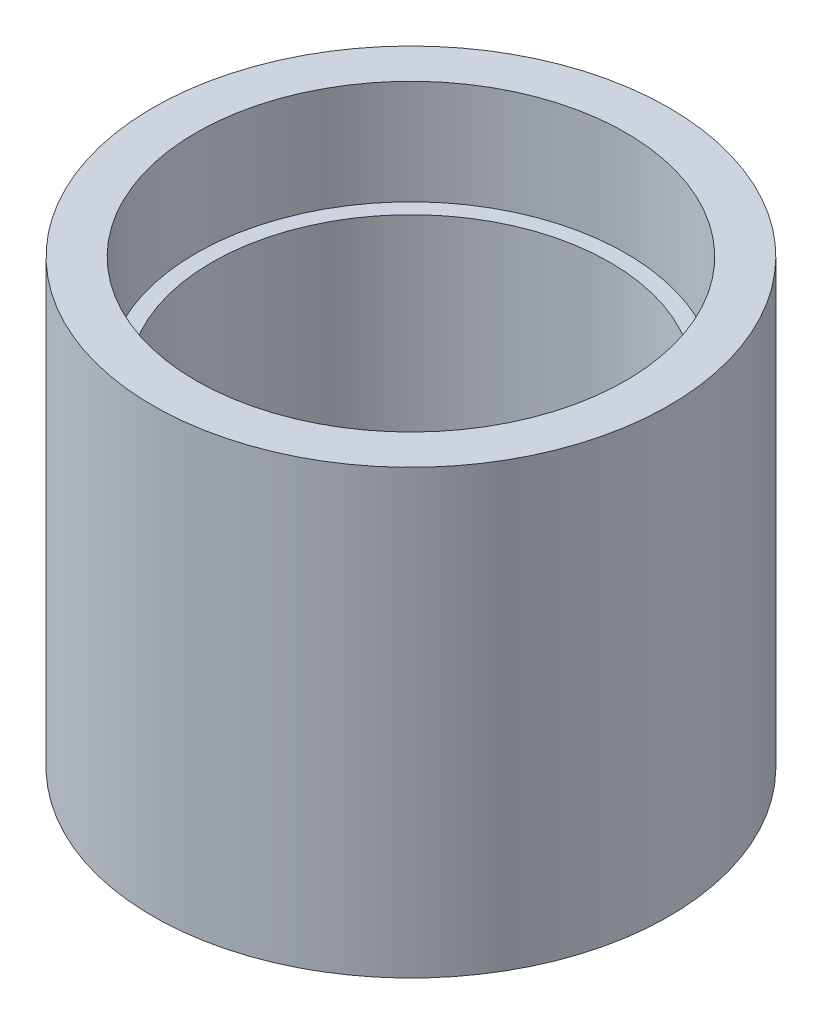
ISO-10303-21;
HEADER;
FILE_DESCRIPTION(('STEP AP214'),'2;1');
FILE_NAME('part.step','',(''),(''),'','','');
FILE_SCHEMA(('AUTOMOTIVE_DESIGN { 1 0 10303 214 1 1 1 1 }'));
ENDSEC;
DATA;
#1=APPLICATION_CONTEXT('core data for automotive mechanical design processes');
#2=APPLICATION_PROTOCOL_DEFINITION('international standard','automotive_design',2000,#1);
#3=PRODUCT_CONTEXT('',#1,'mechanical');
#4=PRODUCT('Part','Part','',(#3));
#5=PRODUCT_RELATED_PRODUCT_CATEGORY('part','',(#4));
#6=PRODUCT_DEFINITION_FORMATION('','',#4);
#7=PRODUCT_DEFINITION_CONTEXT('part definition',#1,'design');
#8=PRODUCT_DEFINITION('design','',#6,#7);
#9=PRODUCT_DEFINITION_SHAPE('','',#8);
#10=(LENGTH_UNIT() NAMED_UNIT(*) SI_UNIT(.MILLI.,.METRE.));
#11=(NAMED_UNIT(*) PLANE_ANGLE_UNIT() SI_UNIT($,.RADIAN.));
#12=(NAMED_UNIT(*) SI_UNIT($,.STERADIAN.) SOLID_ANGLE_UNIT());
#13=UNCERTAINTY_MEASURE_WITH_UNIT(LENGTH_MEASURE(1.E-05),#10,'distance_accuracy_value','');
#14=(GEOMETRIC_REPRESENTATION_CONTEXT(3) GLOBAL_UNCERTAINTY_ASSIGNED_CONTEXT((#13)) GLOBAL_UNIT_ASSIGNED_CONTEXT((#10,
#11,#12)) REPRESENTATION_CONTEXT('',''));
#15=CARTESIAN_POINT('',(0.,0.,0.));
#16=DIRECTION('',(0.,0.,1.));
#17=DIRECTION('',(1.,0.,0.));
#18=AXIS2_PLACEMENT_3D('',#15,#16,#17);
#19=CARTESIAN_POINT('',(0.,38.1,0.));
#20=DIRECTION('',(0.,-1.,0.));
#21=DIRECTION('',(0.,0.,-1.));
#22=AXIS2_PLACEMENT_3D('',#19,#20,#21);
#23=CYLINDRICAL_SURFACE('',#22,22.225);
#24=CARTESIAN_POINT('',(0.,38.1,0.));
#25=DIRECTION('',(0.,1.,0.));
#26=DIRECTION('',(0.,0.,1.));
#27=AXIS2_PLACEMENT_3D('',#24,#25,#26);
#28=CIRCLE('',#27,22.225);
#29=CARTESIAN_POINT('',(0.,38.1,-22.225));
#30=VERTEX_POINT('',#29);
#31=EDGE_CURVE('E10',#30,#30,#28,.T.);
#32=CARTESIAN_POINT('',(0.,0.,0.));
#33=DIRECTION('',(0.,1.,0.));
#34=DIRECTION('',(0.,0.,1.));
#35=AXIS2_PLACEMENT_3D('',#32,#33,#34);
#36=CIRCLE('',#35,22.225);
#37=CARTESIAN_POINT('',(0.,0.,-22.225));
#38=VERTEX_POINT('',#37);
#39=EDGE_CURVE('E44',#38,#38,#36,.T.);
#40=CARTESIAN_POINT('',(0.,38.1,-22.225));
#41=CARTESIAN_POINT('',(0.,37.703125,-22.225));
#42=CARTESIAN_POINT('',(0.,37.30625,-22.225));
#43=CARTESIAN_POINT('',(0.,36.5125,-22.225));
#44=CARTESIAN_POINT('',(0.,36.115625,-22.225));
#45=CARTESIAN_POINT('',(0.,35.321875,-22.225));
#46=CARTESIAN_POINT('',(0.,34.925,-22.225));
#47=CARTESIAN_POINT('',(0.,34.13125,-22.225));
#48=CARTESIAN_POINT('',(0.,33.734375,-22.225));
#49=CARTESIAN_POINT('',(0.,32.940625,-22.225));
#50=CARTESIAN_POINT('',(0.,32.54375,-22.225));
#51=CARTESIAN_POINT('',(0.,31.75,-22.225));
#52=CARTESIAN_POINT('',(0.,31.353125,-22.225));
#53=CARTESIAN_POINT('',(0.,30.559375,-22.225));
#54=CARTESIAN_POINT('',(0.,30.1625,-22.225));
#55=CARTESIAN_POINT('',(0.,29.36875,-22.225));
#56=CARTESIAN_POINT('',(0.,28.971875,-22.225));
#57=CARTESIAN_POINT('',(0.,28.178125,-22.225));
#58=CARTESIAN_POINT('',(0.,27.78125,-22.225));
#59=CARTESIAN_POINT('',(0.,26.9875,-22.225));
#60=CARTESIAN_POINT('',(0.,26.590625,-22.225));
#61=CARTESIAN_POINT('',(0.,25.796875,-22.225));
#62=CARTESIAN_POINT('',(0.,25.4,-22.225));
#63=CARTESIAN_POINT('',(0.,24.60625,-22.225));
#64=CARTESIAN_POINT('',(0.,24.209375,-22.225));
#65=CARTESIAN_POINT('',(0.,23.415625,-22.225));
#66=CARTESIAN_POINT('',(0.,23.01875,-22.225));
#67=CARTESIAN_POINT('',(0.,22.225,-22.225));
#68=CARTESIAN_POINT('',(0.,21.828125,-22.225));
#69=CARTESIAN_POINT('',(0.,21.034375,-22.225));
#70=CARTESIAN_POINT('',(0.,20.6375,-22.225));
#71=CARTESIAN_POINT('',(0.,19.84375,-22.225));
#72=CARTESIAN_POINT('',(0.,19.446875,-22.225));
#73=CARTESIAN_POINT('',(0.,18.653125,-22.225));
#74=CARTESIAN_POINT('',(0.,18.25625,-22.225));
#75=CARTESIAN_POINT('',(0.,17.4625,-22.225));
#76=CARTESIAN_POINT('',(0.,17.065625,-22.225));
#77=CARTESIAN_POINT('',(0.,16.271875,-22.225));
#78=CARTESIAN_POINT('',(0.,15.875,-22.225));
#79=CARTESIAN_POINT('',(0.,15.08125,-22.225));
#80=CARTESIAN_POINT('',(0.,14.684375,-22.225));
#81=CARTESIAN_POINT('',(0.,13.890625,-22.225));
#82=CARTESIAN_POINT('',(0.,13.49375,-22.225));
#83=CARTESIAN_POINT('',(0.,12.7,-22.225));
#84=CARTESIAN_POINT('',(0.,12.303125,-22.225));
#85=CARTESIAN_POINT('',(0.,11.509375,-22.225));
#86=CARTESIAN_POINT('',(0.,11.1125,-22.225));
#87=CARTESIAN_POINT('',(0.,10.31875,-22.225));
#88=CARTESIAN_POINT('',(0.,9.92187499999999,-22.225));
#89=CARTESIAN_POINT('',(0.,9.128125,-22.225));
#90=CARTESIAN_POINT('',(0.,8.73124999999999,-22.225));
#91=CARTESIAN_POINT('',(0.,7.93749999999999,-22.225));
#92=CARTESIAN_POINT('',(0.,7.54062499999999,-22.225));
#93=CARTESIAN_POINT('',(0.,6.746875,-22.225));
#94=CARTESIAN_POINT('',(0.,6.35,-22.225));
#95=CARTESIAN_POINT('',(0.,5.55625,-22.225));
#96=CARTESIAN_POINT('',(0.,5.159375,-22.225));
#97=CARTESIAN_POINT('',(0.,4.365625,-22.225));
#98=CARTESIAN_POINT('',(0.,3.96875,-22.225));
#99=CARTESIAN_POINT('',(0.,3.175,-22.225));
#100=CARTESIAN_POINT('',(0.,2.778125,-22.225));
#101=CARTESIAN_POINT('',(0.,1.984375,-22.225));
#102=CARTESIAN_POINT('',(0.,1.5875,-22.225));
#103=CARTESIAN_POINT('',(0.,0.79375,-22.225));
#104=CARTESIAN_POINT('',(0.,0.396875,-22.225));
#105=CARTESIAN_POINT('',(0.,0.,-22.225));
#106=B_SPLINE_CURVE_WITH_KNOTS('',3,(#40,#41,#42,#43,#44,#45,#46,#47,#48,#49,#50,#51,#52,#53,
#54,#55,#56,#57,#58,#59,#60,#61,#62,#63,#64,#65,#66,#67,#68,#69,#70,#71,#72,#73,#74,#75,#76,#77,
#78,#79,#80,#81,#82,#83,#84,#85,#86,#87,#88,#89,#90,#91,#92,#93,#94,#95,#96,#97,#98,#99,#100,
#101,#102,#103,#104,#105),.UNSPECIFIED.,.F.,.F.,(4,2,2,2,2,2,2,2,2,2,2,2,2,2,2,2,2,2,2,2,2,2,2,
2,2,2,2,2,2,2,2,2,4),(0.,1.190625,2.38125,3.571875,4.7625,5.953125,7.14375,8.334375,
9.52500000000001,10.715625,11.90625,13.096875,14.2875,15.478125,16.66875,17.859375,19.05,
20.240625,21.43125,22.621875,23.8125,25.003125,26.19375,27.384375,28.575,29.765625,30.95625,
32.146875,33.3375,34.528125,35.71875,36.909375,38.1),.UNSPECIFIED.);
#107=EDGE_CURVE('BSEAM37',#30,#38,#106,.T.);
#108=ORIENTED_EDGE('',*,*,#31,.F.);
#109=ORIENTED_EDGE('',*,*,#39,.T.);
#110=ORIENTED_EDGE('',*,*,#107,.T.);
#111=ORIENTED_EDGE('',*,*,#107,.F.);
#112=EDGE_LOOP('',(#108,#110,#109,#111));
#113=FACE_BOUND('',#112,.T.);
#114=ADVANCED_FACE('F37',(#113),#23,.T.);
#115=CARTESIAN_POINT('',(0.,38.1,0.));
#116=DIRECTION('',(0.,1.,0.));
#117=DIRECTION('',(0.,0.,1.));
#118=AXIS2_PLACEMENT_3D('',#115,#116,#117);
#119=PLANE('',#118);
#120=CARTESIAN_POINT('',(0.,38.1,0.));
#121=DIRECTION('',(0.,1.,0.));
#122=DIRECTION('',(0.,0.,1.));
#123=AXIS2_PLACEMENT_3D('',#120,#121,#122);
#124=CIRCLE('',#123,18.5039);
#125=CARTESIAN_POINT('',(0.,38.1,18.5039));
#126=VERTEX_POINT('',#125);
#127=EDGE_CURVE('E51',#126,#126,#124,.T.);
#128=ORIENTED_EDGE('',*,*,#127,.F.);
#129=EDGE_LOOP('',(#128));
#130=FACE_BOUND('',#129,.T.);
#131=ORIENTED_EDGE('',*,*,#31,.T.);
#132=EDGE_LOOP('',(#131));
#133=FACE_BOUND('',#132,.T.);
#134=ADVANCED_FACE('F85',(#130,#133),#119,.T.);
#135=CARTESIAN_POINT('',(0.,0.,0.));
#136=DIRECTION('',(0.,1.,0.));
#137=DIRECTION('',(0.,0.,1.));
#138=AXIS2_PLACEMENT_3D('',#135,#136,#137);
#139=PLANE('',#138);
#140=CARTESIAN_POINT('',(0.,0.,0.));
#141=DIRECTION('',(0.,-1.,0.));
#142=DIRECTION('',(0.,0.,-1.));
#143=AXIS2_PLACEMENT_3D('',#140,#141,#142);
#144=CIRCLE('',#143,18.5039);
#145=CARTESIAN_POINT('',(0.,0.,-18.5039));
#146=VERTEX_POINT('',#145);
#147=EDGE_CURVE('E57',#146,#146,#144,.T.);
#148=ORIENTED_EDGE('',*,*,#147,.F.);
#149=EDGE_LOOP('',(#148));
#150=FACE_BOUND('',#149,.T.);
#151=ORIENTED_EDGE('',*,*,#39,.F.);
#152=EDGE_LOOP('',(#151));
#153=FACE_BOUND('',#152,.T.);
#154=ADVANCED_FACE('F81',(#150,#153),#139,.F.);
#155=CARTESIAN_POINT('',(0.,29.1084,0.));
#156=DIRECTION('',(0.,1.,0.));
#157=DIRECTION('',(0.,0.,1.));
#158=AXIS2_PLACEMENT_3D('',#155,#156,#157);
#159=CYLINDRICAL_SURFACE('',#158,18.5039);
#160=CARTESIAN_POINT('',(0.,29.1084,0.));
#161=DIRECTION('',(0.,1.,0.));
#162=DIRECTION('',(0.,0.,1.));
#163=AXIS2_PLACEMENT_3D('',#160,#161,#162);
#164=CIRCLE('',#163,18.5039);
#165=CARTESIAN_POINT('',(0.,29.1084,18.5039));
#166=VERTEX_POINT('',#165);
#167=EDGE_CURVE('E49',#166,#166,#164,.T.);
#168=ORIENTED_EDGE('',*,*,#167,.F.);
#169=EDGE_LOOP('',(#168));
#170=FACE_BOUND('',#169,.T.);
#171=ORIENTED_EDGE('',*,*,#127,.T.);
#172=EDGE_LOOP('',(#171));
#173=FACE_BOUND('',#172,.T.);
#174=ADVANCED_FACE('F75',(#170,#173),#159,.F.);
#175=CARTESIAN_POINT('',(0.,29.1084,0.));
#176=DIRECTION('',(0.,1.,0.));
#177=DIRECTION('',(0.,0.,1.));
#178=AXIS2_PLACEMENT_3D('',#175,#176,#177);
#179=PLANE('',#178);
#180=CARTESIAN_POINT('',(0.,29.1084,0.));
#181=DIRECTION('',(0.,1.,0.));
#182=DIRECTION('',(0.,0.,1.));
#183=AXIS2_PLACEMENT_3D('',#180,#181,#182);
#184=CIRCLE('',#183,17.145);
#185=CARTESIAN_POINT('',(0.,29.1084,17.145));
#186=VERTEX_POINT('',#185);
#187=EDGE_CURVE('E40',#186,#186,#184,.T.);
#188=ORIENTED_EDGE('',*,*,#187,.F.);
#189=EDGE_LOOP('',(#188));
#190=FACE_BOUND('',#189,.T.);
#191=ORIENTED_EDGE('',*,*,#167,.T.);
#192=EDGE_LOOP('',(#191));
#193=FACE_BOUND('',#192,.T.);
#194=ADVANCED_FACE('F71',(#190,#193),#179,.T.);
#195=CARTESIAN_POINT('',(0.,8.9916,0.));
#196=DIRECTION('',(0.,-1.,0.));
#197=DIRECTION('',(0.,0.,-1.));
#198=AXIS2_PLACEMENT_3D('',#195,#196,#197);
#199=CYLINDRICAL_SURFACE('',#198,18.5039);
#200=CARTESIAN_POINT('',(0.,8.9916,0.));
#201=DIRECTION('',(0.,-1.,0.));
#202=DIRECTION('',(0.,0.,-1.));
#203=AXIS2_PLACEMENT_3D('',#200,#201,#202);
#204=CIRCLE('',#203,18.5039);
#205=CARTESIAN_POINT('',(0.,8.9916,-18.5039));
#206=VERTEX_POINT('',#205);
#207=EDGE_CURVE('E54',#206,#206,#204,.T.);
#208=ORIENTED_EDGE('',*,*,#207,.F.);
#209=EDGE_LOOP('',(#208));
#210=FACE_BOUND('',#209,.T.);
#211=ORIENTED_EDGE('',*,*,#147,.T.);
#212=EDGE_LOOP('',(#211));
#213=FACE_BOUND('',#212,.T.);
#214=ADVANCED_FACE('F74',(#210,#213),#199,.F.);
#215=CARTESIAN_POINT('',(0.,8.9916,0.));
#216=DIRECTION('',(0.,-1.,0.));
#217=DIRECTION('',(0.,0.,-1.));
#218=AXIS2_PLACEMENT_3D('',#215,#216,#217);
#219=PLANE('',#218);
#220=CARTESIAN_POINT('',(0.,8.9916,0.));
#221=DIRECTION('',(0.,-1.,0.));
#222=DIRECTION('',(0.,0.,-1.));
#223=AXIS2_PLACEMENT_3D('',#220,#221,#222);
#224=CIRCLE('',#223,17.145);
#225=CARTESIAN_POINT('',(0.,8.9916,-17.145));
#226=VERTEX_POINT('',#225);
#227=EDGE_CURVE('E62',#226,#226,#224,.T.);
#228=ORIENTED_EDGE('',*,*,#227,.F.);
#229=EDGE_LOOP('',(#228));
#230=FACE_BOUND('',#229,.T.);
#231=ORIENTED_EDGE('',*,*,#207,.T.);
#232=EDGE_LOOP('',(#231));
#233=FACE_BOUND('',#232,.T.);
#234=ADVANCED_FACE('F97',(#230,#233),#219,.T.);
#235=CARTESIAN_POINT('',(0.,38.1,0.));
#236=DIRECTION('',(0.,-1.,0.));
#237=DIRECTION('',(0.,0.,-1.));
#238=AXIS2_PLACEMENT_3D('',#235,#236,#237);
#239=CYLINDRICAL_SURFACE('',#238,17.145);
#240=ORIENTED_EDGE('',*,*,#187,.T.);
#241=EDGE_LOOP('',(#240));
#242=FACE_BOUND('',#241,.T.);
#243=ORIENTED_EDGE('',*,*,#227,.T.);
#244=EDGE_LOOP('',(#243));
#245=FACE_BOUND('',#244,.T.);
#246=ADVANCED_FACE('F69',(#242,#245),#239,.F.);
#247=CLOSED_SHELL('',(#114,#134,#154,#174,#194,#214,#234,#246));
#248=MANIFOLD_SOLID_BREP('B2',#247);
#249=ADVANCED_BREP_SHAPE_REPRESENTATION('',(#18,#248),#14);
#250=SHAPE_DEFINITION_REPRESENTATION(#9,#249);
ENDSEC;
END-ISO-10303-21;
